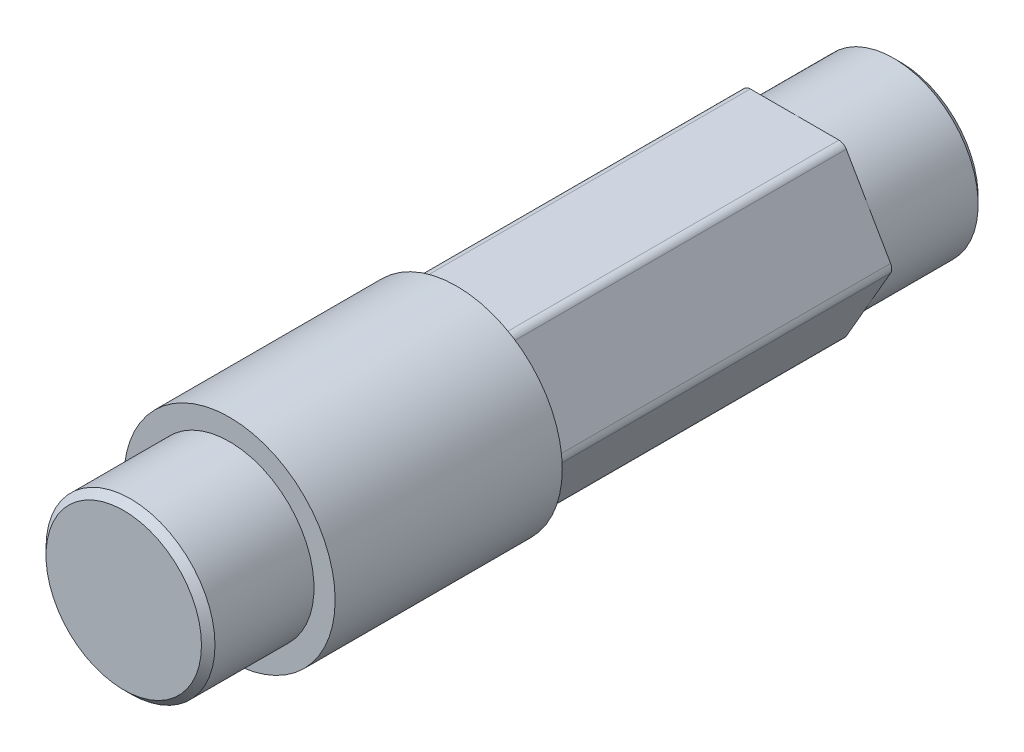
ISO-10303-21;
HEADER;
FILE_DESCRIPTION(('STEP AP214'),'2;1');
FILE_NAME('part.step','',(''),(''),'','','');
FILE_SCHEMA(('AUTOMOTIVE_DESIGN { 1 0 10303 214 1 1 1 1 }'));
ENDSEC;
DATA;
#1=APPLICATION_CONTEXT('core data for automotive mechanical design processes');
#2=APPLICATION_PROTOCOL_DEFINITION('international standard','automotive_design',2000,#1);
#3=PRODUCT_CONTEXT('',#1,'mechanical');
#4=PRODUCT('Part','Part','',(#3));
#5=PRODUCT_RELATED_PRODUCT_CATEGORY('part','',(#4));
#6=PRODUCT_DEFINITION_FORMATION('','',#4);
#7=PRODUCT_DEFINITION_CONTEXT('part definition',#1,'design');
#8=PRODUCT_DEFINITION('design','',#6,#7);
#9=PRODUCT_DEFINITION_SHAPE('','',#8);
#10=(LENGTH_UNIT() NAMED_UNIT(*) SI_UNIT(.MILLI.,.METRE.));
#11=(NAMED_UNIT(*) PLANE_ANGLE_UNIT() SI_UNIT($,.RADIAN.));
#12=(NAMED_UNIT(*) SI_UNIT($,.STERADIAN.) SOLID_ANGLE_UNIT());
#13=UNCERTAINTY_MEASURE_WITH_UNIT(LENGTH_MEASURE(1.E-05),#10,'distance_accuracy_value','');
#14=(GEOMETRIC_REPRESENTATION_CONTEXT(3) GLOBAL_UNCERTAINTY_ASSIGNED_CONTEXT((#13)) GLOBAL_UNIT_ASSIGNED_CONTEXT((#10,
#11,#12)) REPRESENTATION_CONTEXT('',''));
#15=CARTESIAN_POINT('',(0.,0.,0.));
#16=DIRECTION('',(0.,0.,1.));
#17=DIRECTION('',(1.,0.,0.));
#18=AXIS2_PLACEMENT_3D('',#15,#16,#17);
#19=CARTESIAN_POINT('',(0.,0.,25.019));
#20=DIRECTION('',(0.,0.,1.));
#21=DIRECTION('',(1.,0.,0.));
#22=AXIS2_PLACEMENT_3D('',#19,#20,#21);
#23=PLANE('',#22);
#24=CARTESIAN_POINT('',(0.,0.,25.019));
#25=DIRECTION('',(0.,0.,1.));
#26=DIRECTION('',(1.,0.,0.));
#27=AXIS2_PLACEMENT_3D('',#24,#25,#26);
#28=CIRCLE('',#27,5.842);
#29=CARTESIAN_POINT('',(5.842,0.,25.019));
#30=VERTEX_POINT('',#29);
#31=EDGE_CURVE('E144',#30,#30,#28,.T.);
#32=ORIENTED_EDGE('',*,*,#31,.T.);
#33=EDGE_LOOP('',(#32));
#34=FACE_BOUND('',#33,.T.);
#35=ADVANCED_FACE('F35',(#34),#23,.T.);
#36=CARTESIAN_POINT('',(0.,0.,0.));
#37=DIRECTION('',(0.,0.,-1.));
#38=DIRECTION('',(-1.,0.,0.));
#39=AXIS2_PLACEMENT_3D('',#36,#37,#38);
#40=CYLINDRICAL_SURFACE('',#39,6.35);
#41=CARTESIAN_POINT('',(0.,0.,24.511));
#42=DIRECTION('',(0.,0.,1.));
#43=DIRECTION('',(1.,0.,0.));
#44=AXIS2_PLACEMENT_3D('',#41,#42,#43);
#45=CIRCLE('',#44,6.35);
#46=CARTESIAN_POINT('',(6.35,0.,24.511));
#47=VERTEX_POINT('',#46);
#48=EDGE_CURVE('E148',#47,#47,#45,.F.);
#49=ORIENTED_EDGE('',*,*,#48,.T.);
#50=EDGE_LOOP('',(#49));
#51=FACE_BOUND('',#50,.T.);
#52=CARTESIAN_POINT('',(0.,0.,17.0688));
#53=DIRECTION('',(0.,0.,-1.));
#54=DIRECTION('',(-1.,0.,0.));
#55=AXIS2_PLACEMENT_3D('',#52,#53,#54);
#56=CIRCLE('',#55,6.35);
#57=CARTESIAN_POINT('',(-6.35,0.,17.0688));
#58=VERTEX_POINT('',#57);
#59=EDGE_CURVE('E239',#58,#58,#56,.T.);
#60=ORIENTED_EDGE('',*,*,#59,.F.);
#61=EDGE_LOOP('',(#60));
#62=FACE_BOUND('',#61,.T.);
#63=ADVANCED_FACE('F250',(#51,#62),#40,.T.);
#64=CARTESIAN_POINT('',(0.,6.35,17.0688));
#65=DIRECTION('',(0.,0.,1.));
#66=DIRECTION('',(1.,0.,0.));
#67=AXIS2_PLACEMENT_3D('',#64,#65,#66);
#68=PLANE('',#67);
#69=ORIENTED_EDGE('',*,*,#59,.T.);
#70=EDGE_LOOP('',(#69));
#71=FACE_BOUND('',#70,.T.);
#72=CARTESIAN_POINT('',(0.,0.,17.0688));
#73=DIRECTION('',(0.,0.,-1.));
#74=DIRECTION('',(-1.,0.,0.));
#75=AXIS2_PLACEMENT_3D('',#72,#73,#74);
#76=CIRCLE('',#75,7.9375);
#77=CARTESIAN_POINT('',(-7.9375,0.,17.0688));
#78=VERTEX_POINT('',#77);
#79=EDGE_CURVE('E236',#78,#78,#76,.T.);
#80=ORIENTED_EDGE('',*,*,#79,.F.);
#81=EDGE_LOOP('',(#80));
#82=FACE_BOUND('',#81,.T.);
#83=ADVANCED_FACE('F276',(#71,#82),#68,.T.);
#84=CARTESIAN_POINT('',(0.,0.,0.));
#85=DIRECTION('',(0.,0.,-1.));
#86=DIRECTION('',(-1.,0.,0.));
#87=AXIS2_PLACEMENT_3D('',#84,#85,#86);
#88=CYLINDRICAL_SURFACE('',#87,7.9375);
#89=ORIENTED_EDGE('',*,*,#79,.T.);
#90=EDGE_LOOP('',(#89));
#91=FACE_BOUND('',#90,.T.);
#92=CARTESIAN_POINT('',(0.,0.,0.));
#93=DIRECTION('',(0.,0.,-1.));
#94=DIRECTION('',(-1.,0.,0.));
#95=AXIS2_PLACEMENT_3D('',#92,#93,#94);
#96=CIRCLE('',#95,7.9375);
#97=CARTESIAN_POINT('',(-7.9375,0.,0.));
#98=VERTEX_POINT('',#97);
#99=EDGE_CURVE('E232',#98,#98,#96,.T.);
#100=ORIENTED_EDGE('',*,*,#99,.F.);
#101=EDGE_LOOP('',(#100));
#102=FACE_BOUND('',#101,.T.);
#103=ADVANCED_FACE('F281',(#91,#102),#88,.T.);
#104=CARTESIAN_POINT('',(0.,7.9375,0.));
#105=DIRECTION('',(0.,0.,-1.));
#106=DIRECTION('',(-1.,0.,0.));
#107=AXIS2_PLACEMENT_3D('',#104,#105,#106);
#108=PLANE('',#107);
#109=ORIENTED_EDGE('',*,*,#99,.T.);
#110=EDGE_LOOP('',(#109));
#111=FACE_BOUND('',#110,.T.);
#112=DIRECTION('',(-0.499999999999999,0.866025403784439,0.));
#113=VECTOR('',#112,1.);
#114=CARTESIAN_POINT('',(3.6969700727127,6.40334,0.));
#115=LINE('',#114,#113);
#116=CARTESIAN_POINT('',(7.21063143495769,0.317499999999993,0.));
#117=VERTEX_POINT('',#116);
#118=CARTESIAN_POINT('',(3.88027878318041,6.08584,0.));
#119=VERTEX_POINT('',#118);
#120=EDGE_CURVE('E233',#117,#119,#115,.T.);
#121=ORIENTED_EDGE('',*,*,#120,.T.);
#122=CARTESIAN_POINT('',(3.33035265177729,5.76834,0.));
#123=DIRECTION('',(0.,0.,-1.));
#124=DIRECTION('',(-1.,0.,0.));
#125=AXIS2_PLACEMENT_3D('',#122,#123,#124);
#126=CIRCLE('',#125,0.635);
#127=CARTESIAN_POINT('',(3.33035265177729,6.40334,0.));
#128=VERTEX_POINT('',#127);
#129=EDGE_CURVE('E184',#119,#128,#126,.F.);
#130=ORIENTED_EDGE('',*,*,#129,.T.);
#131=DIRECTION('',(-1.,0.,0.));
#132=VECTOR('',#131,1.);
#133=CARTESIAN_POINT('',(-3.6969700727127,6.40334,0.));
#134=LINE('',#133,#132);
#135=CARTESIAN_POINT('',(-3.33035265177728,6.40334,0.));
#136=VERTEX_POINT('',#135);
#137=EDGE_CURVE('E227',#128,#136,#134,.T.);
#138=ORIENTED_EDGE('',*,*,#137,.T.);
#139=CARTESIAN_POINT('',(-3.33035265177728,5.76834,0.));
#140=DIRECTION('',(0.,0.,-1.));
#141=DIRECTION('',(-1.,0.,0.));
#142=AXIS2_PLACEMENT_3D('',#139,#140,#141);
#143=CIRCLE('',#142,0.635);
#144=CARTESIAN_POINT('',(-3.8802787831804,6.08584,0.));
#145=VERTEX_POINT('',#144);
#146=EDGE_CURVE('E12',#136,#145,#143,.F.);
#147=ORIENTED_EDGE('',*,*,#146,.T.);
#148=DIRECTION('',(-0.5,-0.866025403784439,0.));
#149=VECTOR('',#148,1.);
#150=CARTESIAN_POINT('',(-7.3939401454254,0.,0.));
#151=LINE('',#150,#149);
#152=CARTESIAN_POINT('',(-7.21063143495769,0.317500000000003,0.));
#153=VERTEX_POINT('',#152);
#154=EDGE_CURVE('E198',#145,#153,#151,.T.);
#155=ORIENTED_EDGE('',*,*,#154,.T.);
#156=CARTESIAN_POINT('',(-6.66070530355457,0.,0.));
#157=DIRECTION('',(0.,0.,-1.));
#158=DIRECTION('',(-1.,0.,0.));
#159=AXIS2_PLACEMENT_3D('',#156,#157,#158);
#160=CIRCLE('',#159,0.635);
#161=CARTESIAN_POINT('',(-7.21063143495769,-0.317499999999997,0.));
#162=VERTEX_POINT('',#161);
#163=EDGE_CURVE('E43',#153,#162,#160,.F.);
#164=ORIENTED_EDGE('',*,*,#163,.T.);
#165=DIRECTION('',(0.5,-0.866025403784439,0.));
#166=VECTOR('',#165,1.);
#167=CARTESIAN_POINT('',(-3.6969700727127,-6.40334,0.));
#168=LINE('',#167,#166);
#169=CARTESIAN_POINT('',(-3.88027878318041,-6.08584,0.));
#170=VERTEX_POINT('',#169);
#171=EDGE_CURVE('E196',#162,#170,#168,.T.);
#172=ORIENTED_EDGE('',*,*,#171,.T.);
#173=CARTESIAN_POINT('',(-3.33035265177729,-5.76834,0.));
#174=DIRECTION('',(0.,0.,-1.));
#175=DIRECTION('',(-1.,0.,0.));
#176=AXIS2_PLACEMENT_3D('',#173,#174,#175);
#177=CIRCLE('',#176,0.635);
#178=CARTESIAN_POINT('',(-3.33035265177729,-6.40334,0.));
#179=VERTEX_POINT('',#178);
#180=EDGE_CURVE('E190',#170,#179,#177,.F.);
#181=ORIENTED_EDGE('',*,*,#180,.T.);
#182=DIRECTION('',(1.,0.,0.));
#183=VECTOR('',#182,1.);
#184=CARTESIAN_POINT('',(3.6969700727127,-6.40334,0.));
#185=LINE('',#184,#183);
#186=CARTESIAN_POINT('',(3.33035265177728,-6.40334,0.));
#187=VERTEX_POINT('',#186);
#188=EDGE_CURVE('E206',#179,#187,#185,.T.);
#189=ORIENTED_EDGE('',*,*,#188,.T.);
#190=CARTESIAN_POINT('',(3.33035265177728,-5.76834,0.));
#191=DIRECTION('',(0.,0.,-1.));
#192=DIRECTION('',(-1.,0.,0.));
#193=AXIS2_PLACEMENT_3D('',#190,#191,#192);
#194=CIRCLE('',#193,0.635);
#195=CARTESIAN_POINT('',(3.8802787831804,-6.08584,0.));
#196=VERTEX_POINT('',#195);
#197=EDGE_CURVE('E188',#187,#196,#194,.F.);
#198=ORIENTED_EDGE('',*,*,#197,.T.);
#199=DIRECTION('',(0.5,0.866025403784438,0.));
#200=VECTOR('',#199,1.);
#201=CARTESIAN_POINT('',(7.39394014542539,0.,0.));
#202=LINE('',#201,#200);
#203=CARTESIAN_POINT('',(7.21063143495769,-0.317500000000005,0.));
#204=VERTEX_POINT('',#203);
#205=EDGE_CURVE('E333',#196,#204,#202,.T.);
#206=ORIENTED_EDGE('',*,*,#205,.T.);
#207=CARTESIAN_POINT('',(6.66070530355457,0.,0.));
#208=DIRECTION('',(0.,0.,-1.));
#209=DIRECTION('',(-1.,0.,0.));
#210=AXIS2_PLACEMENT_3D('',#207,#208,#209);
#211=CIRCLE('',#210,0.635);
#212=EDGE_CURVE('E186',#204,#117,#211,.F.);
#213=ORIENTED_EDGE('',*,*,#212,.T.);
#214=EDGE_LOOP('',(#121,#130,#138,#147,#155,#164,#172,#181,#189,#198,#206,#213));
#215=FACE_BOUND('',#214,.T.);
#216=ADVANCED_FACE('F195',(#111,#215),#108,.T.);
#217=CARTESIAN_POINT('',(-3.6969700727127,6.40334,22.6751467056996));
#218=DIRECTION('',(0.,1.,0.));
#219=DIRECTION('',(-1.,0.,0.));
#220=AXIS2_PLACEMENT_3D('',#217,#218,#219);
#221=PLANE('',#220);
#222=ORIENTED_EDGE('',*,*,#137,.F.);
#223=DIRECTION('',(0.,0.,-1.));
#224=VECTOR('',#223,1.);
#225=CARTESIAN_POINT('',(3.33035265177729,6.40334,22.6751467056996));
#226=LINE('',#225,#224);
#227=CARTESIAN_POINT('',(3.33035265177729,6.40334,-25.4));
#228=VERTEX_POINT('',#227);
#229=EDGE_CURVE('E134',#128,#228,#226,.T.);
#230=ORIENTED_EDGE('',*,*,#229,.T.);
#231=DIRECTION('',(1.,0.,0.));
#232=VECTOR('',#231,1.);
#233=CARTESIAN_POINT('',(-3.6969700727127,6.40334,-25.4));
#234=LINE('',#233,#232);
#235=CARTESIAN_POINT('',(-3.33035265177728,6.40334,-25.4));
#236=VERTEX_POINT('',#235);
#237=EDGE_CURVE('E127',#236,#228,#234,.T.);
#238=ORIENTED_EDGE('',*,*,#237,.F.);
#239=DIRECTION('',(0.,0.,-1.));
#240=VECTOR('',#239,1.);
#241=CARTESIAN_POINT('',(-3.33035265177728,6.40334,22.6751467056996));
#242=LINE('',#241,#240);
#243=EDGE_CURVE('E140',#236,#136,#242,.F.);
#244=ORIENTED_EDGE('',*,*,#243,.T.);
#245=EDGE_LOOP('',(#222,#230,#238,#244));
#246=FACE_BOUND('',#245,.T.);
#247=ADVANCED_FACE('F139',(#246),#221,.T.);
#248=CARTESIAN_POINT('',(3.6969700727127,6.40334,22.6751467056996));
#249=DIRECTION('',(0.866025403784439,0.499999999999999,0.));
#250=DIRECTION('',(-0.499999999999999,0.866025403784439,0.));
#251=AXIS2_PLACEMENT_3D('',#248,#249,#250);
#252=PLANE('',#251);
#253=DIRECTION('',(0.499999999999999,-0.866025403784439,0.));
#254=VECTOR('',#253,1.);
#255=CARTESIAN_POINT('',(3.6969700727127,6.40334,-25.4));
#256=LINE('',#255,#254);
#257=CARTESIAN_POINT('',(3.88027878318041,6.08584,-25.4));
#258=VERTEX_POINT('',#257);
#259=CARTESIAN_POINT('',(7.21063143495769,0.317499999999993,-25.4));
#260=VERTEX_POINT('',#259);
#261=EDGE_CURVE('E142',#258,#260,#256,.T.);
#262=ORIENTED_EDGE('',*,*,#261,.F.);
#263=DIRECTION('',(0.,0.,-1.));
#264=VECTOR('',#263,1.);
#265=CARTESIAN_POINT('',(3.88027878318041,6.08584,22.6751467056996));
#266=LINE('',#265,#264);
#267=EDGE_CURVE('E164',#258,#119,#266,.F.);
#268=ORIENTED_EDGE('',*,*,#267,.T.);
#269=ORIENTED_EDGE('',*,*,#120,.F.);
#270=DIRECTION('',(0.,0.,-1.));
#271=VECTOR('',#270,1.);
#272=CARTESIAN_POINT('',(7.21063143495769,0.317499999999994,22.6751467056996));
#273=LINE('',#272,#271);
#274=EDGE_CURVE('E161',#117,#260,#273,.T.);
#275=ORIENTED_EDGE('',*,*,#274,.T.);
#276=EDGE_LOOP('',(#262,#268,#269,#275));
#277=FACE_BOUND('',#276,.T.);
#278=ADVANCED_FACE('F304',(#277),#252,.T.);
#279=CARTESIAN_POINT('',(7.39394014542539,0.,22.6751467056996));
#280=DIRECTION('',(0.866025403784438,-0.5,0.));
#281=DIRECTION('',(0.5,0.866025403784438,0.));
#282=AXIS2_PLACEMENT_3D('',#279,#280,#281);
#283=PLANE('',#282);
#284=DIRECTION('',(-0.5,-0.866025403784438,0.));
#285=VECTOR('',#284,1.);
#286=CARTESIAN_POINT('',(7.39394014542539,0.,-25.4));
#287=LINE('',#286,#285);
#288=CARTESIAN_POINT('',(7.21063143495769,-0.317500000000005,-25.4));
#289=VERTEX_POINT('',#288);
#290=CARTESIAN_POINT('',(3.8802787831804,-6.08584,-25.4));
#291=VERTEX_POINT('',#290);
#292=EDGE_CURVE('E220',#289,#291,#287,.T.);
#293=ORIENTED_EDGE('',*,*,#292,.F.);
#294=DIRECTION('',(0.,0.,-1.));
#295=VECTOR('',#294,1.);
#296=CARTESIAN_POINT('',(7.21063143495769,-0.317500000000006,22.6751467056996));
#297=LINE('',#296,#295);
#298=EDGE_CURVE('E169',#289,#204,#297,.F.);
#299=ORIENTED_EDGE('',*,*,#298,.T.);
#300=ORIENTED_EDGE('',*,*,#205,.F.);
#301=DIRECTION('',(0.,0.,-1.));
#302=VECTOR('',#301,1.);
#303=CARTESIAN_POINT('',(3.8802787831804,-6.08584,22.6751467056996));
#304=LINE('',#303,#302);
#305=EDGE_CURVE('E166',#196,#291,#304,.T.);
#306=ORIENTED_EDGE('',*,*,#305,.T.);
#307=EDGE_LOOP('',(#293,#299,#300,#306));
#308=FACE_BOUND('',#307,.T.);
#309=ADVANCED_FACE('F307',(#308),#283,.T.);
#310=CARTESIAN_POINT('',(3.6969700727127,-6.40334,22.6751467056996));
#311=DIRECTION('',(0.,-1.,0.));
#312=DIRECTION('',(1.,0.,0.));
#313=AXIS2_PLACEMENT_3D('',#310,#311,#312);
#314=PLANE('',#313);
#315=DIRECTION('',(-1.,0.,0.));
#316=VECTOR('',#315,1.);
#317=CARTESIAN_POINT('',(3.6969700727127,-6.40334,-25.4));
#318=LINE('',#317,#316);
#319=CARTESIAN_POINT('',(3.33035265177728,-6.40334,-25.4));
#320=VERTEX_POINT('',#319);
#321=CARTESIAN_POINT('',(-3.33035265177729,-6.40334,-25.4));
#322=VERTEX_POINT('',#321);
#323=EDGE_CURVE('E223',#320,#322,#318,.T.);
#324=ORIENTED_EDGE('',*,*,#323,.F.);
#325=DIRECTION('',(0.,0.,-1.));
#326=VECTOR('',#325,1.);
#327=CARTESIAN_POINT('',(3.33035265177728,-6.40334,22.6751467056996));
#328=LINE('',#327,#326);
#329=EDGE_CURVE('E174',#320,#187,#328,.F.);
#330=ORIENTED_EDGE('',*,*,#329,.T.);
#331=ORIENTED_EDGE('',*,*,#188,.F.);
#332=DIRECTION('',(0.,0.,-1.));
#333=VECTOR('',#332,1.);
#334=CARTESIAN_POINT('',(-3.33035265177729,-6.40334,22.6751467056996));
#335=LINE('',#334,#333);
#336=EDGE_CURVE('E171',#179,#322,#335,.T.);
#337=ORIENTED_EDGE('',*,*,#336,.T.);
#338=EDGE_LOOP('',(#324,#330,#331,#337));
#339=FACE_BOUND('',#338,.T.);
#340=ADVANCED_FACE('F311',(#339),#314,.T.);
#341=CARTESIAN_POINT('',(-3.6969700727127,-6.40334,22.6751467056996));
#342=DIRECTION('',(-0.866025403784439,-0.5,0.));
#343=DIRECTION('',(0.5,-0.866025403784439,0.));
#344=AXIS2_PLACEMENT_3D('',#341,#342,#343);
#345=PLANE('',#344);
#346=DIRECTION('',(-0.5,0.866025403784439,0.));
#347=VECTOR('',#346,1.);
#348=CARTESIAN_POINT('',(-3.6969700727127,-6.40334,-25.4));
#349=LINE('',#348,#347);
#350=CARTESIAN_POINT('',(-3.88027878318041,-6.08584,-25.4));
#351=VERTEX_POINT('',#350);
#352=CARTESIAN_POINT('',(-7.21063143495769,-0.317499999999997,-25.4));
#353=VERTEX_POINT('',#352);
#354=EDGE_CURVE('E209',#351,#353,#349,.T.);
#355=ORIENTED_EDGE('',*,*,#354,.F.);
#356=DIRECTION('',(0.,0.,-1.));
#357=VECTOR('',#356,1.);
#358=CARTESIAN_POINT('',(-3.88027878318041,-6.08584,22.6751467056996));
#359=LINE('',#358,#357);
#360=EDGE_CURVE('E179',#351,#170,#359,.F.);
#361=ORIENTED_EDGE('',*,*,#360,.T.);
#362=ORIENTED_EDGE('',*,*,#171,.F.);
#363=DIRECTION('',(0.,0.,-1.));
#364=VECTOR('',#363,1.);
#365=CARTESIAN_POINT('',(-7.21063143495769,-0.317499999999997,22.6751467056996));
#366=LINE('',#365,#364);
#367=EDGE_CURVE('E176',#162,#353,#366,.T.);
#368=ORIENTED_EDGE('',*,*,#367,.T.);
#369=EDGE_LOOP('',(#355,#361,#362,#368));
#370=FACE_BOUND('',#369,.T.);
#371=ADVANCED_FACE('F203',(#370),#345,.T.);
#372=CARTESIAN_POINT('',(-7.3939401454254,0.,22.6751467056996));
#373=DIRECTION('',(-0.866025403784438,0.5,0.));
#374=DIRECTION('',(-0.5,-0.866025403784439,0.));
#375=AXIS2_PLACEMENT_3D('',#372,#373,#374);
#376=PLANE('',#375);
#377=DIRECTION('',(0.5,0.866025403784439,0.));
#378=VECTOR('',#377,1.);
#379=CARTESIAN_POINT('',(-7.3939401454254,0.,-25.4));
#380=LINE('',#379,#378);
#381=CARTESIAN_POINT('',(-7.21063143495769,0.317500000000003,-25.4));
#382=VERTEX_POINT('',#381);
#383=CARTESIAN_POINT('',(-3.8802787831804,6.08584,-25.4));
#384=VERTEX_POINT('',#383);
#385=EDGE_CURVE('E128',#382,#384,#380,.T.);
#386=ORIENTED_EDGE('',*,*,#385,.F.);
#387=DIRECTION('',(0.,0.,-1.));
#388=VECTOR('',#387,1.);
#389=CARTESIAN_POINT('',(-7.21063143495769,0.317500000000003,22.6751467056996));
#390=LINE('',#389,#388);
#391=EDGE_CURVE('E50',#382,#153,#390,.F.);
#392=ORIENTED_EDGE('',*,*,#391,.T.);
#393=ORIENTED_EDGE('',*,*,#154,.F.);
#394=DIRECTION('',(0.,0.,-1.));
#395=VECTOR('',#394,1.);
#396=CARTESIAN_POINT('',(-3.8802787831804,6.08584,22.6751467056996));
#397=LINE('',#396,#395);
#398=EDGE_CURVE('E181',#145,#384,#397,.T.);
#399=ORIENTED_EDGE('',*,*,#398,.T.);
#400=EDGE_LOOP('',(#386,#392,#393,#399));
#401=FACE_BOUND('',#400,.T.);
#402=ADVANCED_FACE('F210',(#401),#376,.T.);
#403=CARTESIAN_POINT('',(0.,6.35,-33.3502));
#404=DIRECTION('',(0.,0.,-1.));
#405=DIRECTION('',(-1.,0.,0.));
#406=AXIS2_PLACEMENT_3D('',#403,#404,#405);
#407=PLANE('',#406);
#408=CARTESIAN_POINT('',(0.,0.,-33.3502));
#409=DIRECTION('',(0.,0.,-1.));
#410=DIRECTION('',(-1.,0.,0.));
#411=AXIS2_PLACEMENT_3D('',#408,#409,#410);
#412=CIRCLE('',#411,3.175);
#413=CARTESIAN_POINT('',(-3.175,0.,-33.3502));
#414=VERTEX_POINT('',#413);
#415=EDGE_CURVE('E214',#414,#414,#412,.T.);
#416=ORIENTED_EDGE('',*,*,#415,.F.);
#417=EDGE_LOOP('',(#416));
#418=FACE_BOUND('',#417,.T.);
#419=CARTESIAN_POINT('',(0.,0.,-33.3502));
#420=DIRECTION('',(0.,0.,-1.));
#421=DIRECTION('',(-1.,0.,0.));
#422=AXIS2_PLACEMENT_3D('',#419,#420,#421);
#423=CIRCLE('',#422,5.842);
#424=CARTESIAN_POINT('',(-5.842,0.,-33.3502));
#425=VERTEX_POINT('',#424);
#426=EDGE_CURVE('E242',#425,#425,#423,.T.);
#427=ORIENTED_EDGE('',*,*,#426,.T.);
#428=EDGE_LOOP('',(#427));
#429=FACE_BOUND('',#428,.T.);
#430=ADVANCED_FACE('F295',(#418,#429),#407,.T.);
#431=CARTESIAN_POINT('',(0.,0.,0.));
#432=DIRECTION('',(0.,0.,-1.));
#433=DIRECTION('',(-1.,0.,0.));
#434=AXIS2_PLACEMENT_3D('',#431,#432,#433);
#435=CYLINDRICAL_SURFACE('',#434,6.35);
#436=CARTESIAN_POINT('',(0.,0.,-32.8422));
#437=DIRECTION('',(0.,0.,-1.));
#438=DIRECTION('',(-1.,0.,0.));
#439=AXIS2_PLACEMENT_3D('',#436,#437,#438);
#440=CIRCLE('',#439,6.35);
#441=CARTESIAN_POINT('',(-6.35,0.,-32.8422));
#442=VERTEX_POINT('',#441);
#443=EDGE_CURVE('E245',#442,#442,#440,.F.);
#444=ORIENTED_EDGE('',*,*,#443,.T.);
#445=EDGE_LOOP('',(#444));
#446=FACE_BOUND('',#445,.T.);
#447=CARTESIAN_POINT('',(0.,0.,-25.4));
#448=DIRECTION('',(0.,0.,-1.));
#449=DIRECTION('',(-1.,0.,0.));
#450=AXIS2_PLACEMENT_3D('',#447,#448,#449);
#451=CIRCLE('',#450,6.35);
#452=CARTESIAN_POINT('',(-6.35,0.,-25.4));
#453=VERTEX_POINT('',#452);
#454=EDGE_CURVE('E229',#453,#453,#451,.T.);
#455=ORIENTED_EDGE('',*,*,#454,.T.);
#456=EDGE_LOOP('',(#455));
#457=FACE_BOUND('',#456,.T.);
#458=ADVANCED_FACE('F291',(#446,#457),#435,.T.);
#459=CARTESIAN_POINT('',(0.,7.62,-25.4));
#460=DIRECTION('',(0.,0.,-1.));
#461=DIRECTION('',(-1.,0.,0.));
#462=AXIS2_PLACEMENT_3D('',#459,#460,#461);
#463=PLANE('',#462);
#464=ORIENTED_EDGE('',*,*,#454,.F.);
#465=EDGE_LOOP('',(#464));
#466=FACE_BOUND('',#465,.T.);
#467=ORIENTED_EDGE('',*,*,#237,.T.);
#468=CARTESIAN_POINT('',(3.33035265177729,5.76834,-25.4));
#469=DIRECTION('',(0.,0.,-1.));
#470=DIRECTION('',(-1.,0.,0.));
#471=AXIS2_PLACEMENT_3D('',#468,#469,#470);
#472=CIRCLE('',#471,0.635);
#473=EDGE_CURVE('E159',#228,#258,#472,.T.);
#474=ORIENTED_EDGE('',*,*,#473,.T.);
#475=ORIENTED_EDGE('',*,*,#261,.T.);
#476=CARTESIAN_POINT('',(6.66070530355457,0.,-25.4));
#477=DIRECTION('',(0.,0.,-1.));
#478=DIRECTION('',(-1.,0.,0.));
#479=AXIS2_PLACEMENT_3D('',#476,#477,#478);
#480=CIRCLE('',#479,0.635);
#481=EDGE_CURVE('E157',#260,#289,#480,.T.);
#482=ORIENTED_EDGE('',*,*,#481,.T.);
#483=ORIENTED_EDGE('',*,*,#292,.T.);
#484=CARTESIAN_POINT('',(3.33035265177728,-5.76834,-25.4));
#485=DIRECTION('',(0.,0.,-1.));
#486=DIRECTION('',(-1.,0.,0.));
#487=AXIS2_PLACEMENT_3D('',#484,#485,#486);
#488=CIRCLE('',#487,0.635);
#489=EDGE_CURVE('E155',#291,#320,#488,.T.);
#490=ORIENTED_EDGE('',*,*,#489,.T.);
#491=ORIENTED_EDGE('',*,*,#323,.T.);
#492=CARTESIAN_POINT('',(-3.33035265177729,-5.76834,-25.4));
#493=DIRECTION('',(0.,0.,-1.));
#494=DIRECTION('',(-1.,0.,0.));
#495=AXIS2_PLACEMENT_3D('',#492,#493,#494);
#496=CIRCLE('',#495,0.635);
#497=EDGE_CURVE('E153',#322,#351,#496,.T.);
#498=ORIENTED_EDGE('',*,*,#497,.T.);
#499=ORIENTED_EDGE('',*,*,#354,.T.);
#500=CARTESIAN_POINT('',(-6.66070530355457,0.,-25.4));
#501=DIRECTION('',(0.,0.,-1.));
#502=DIRECTION('',(-1.,0.,0.));
#503=AXIS2_PLACEMENT_3D('',#500,#501,#502);
#504=CIRCLE('',#503,0.635);
#505=EDGE_CURVE('E133',#353,#382,#504,.T.);
#506=ORIENTED_EDGE('',*,*,#505,.T.);
#507=ORIENTED_EDGE('',*,*,#385,.T.);
#508=CARTESIAN_POINT('',(-3.33035265177728,5.76834,-25.4));
#509=DIRECTION('',(0.,0.,-1.));
#510=DIRECTION('',(-1.,0.,0.));
#511=AXIS2_PLACEMENT_3D('',#508,#509,#510);
#512=CIRCLE('',#511,0.635);
#513=EDGE_CURVE('E124',#384,#236,#512,.T.);
#514=ORIENTED_EDGE('',*,*,#513,.T.);
#515=EDGE_LOOP('',(#467,#474,#475,#482,#483,#490,#491,#498,#499,#506,#507,#514));
#516=FACE_BOUND('',#515,.T.);
#517=ADVANCED_FACE('F126',(#466,#516),#463,.T.);
#518=CARTESIAN_POINT('',(0.,0.,-33.3502));
#519=DIRECTION('',(0.,0.,1.));
#520=DIRECTION('',(1.,0.,0.));
#521=AXIS2_PLACEMENT_3D('',#518,#519,#520);
#522=CONICAL_SURFACE('',#521,5.842,0.78539816339745);
#523=ORIENTED_EDGE('',*,*,#443,.F.);
#524=EDGE_LOOP('',(#523));
#525=FACE_BOUND('',#524,.T.);
#526=ORIENTED_EDGE('',*,*,#426,.F.);
#527=EDGE_LOOP('',(#526));
#528=FACE_BOUND('',#527,.T.);
#529=ADVANCED_FACE('F256',(#525,#528),#522,.T.);
#530=CARTESIAN_POINT('',(0.,0.,24.511));
#531=DIRECTION('',(0.,0.,-1.));
#532=DIRECTION('',(-1.,0.,0.));
#533=AXIS2_PLACEMENT_3D('',#530,#531,#532);
#534=CONICAL_SURFACE('',#533,6.35,0.785398163397457);
#535=ORIENTED_EDGE('',*,*,#31,.F.);
#536=EDGE_LOOP('',(#535));
#537=FACE_BOUND('',#536,.T.);
#538=ORIENTED_EDGE('',*,*,#48,.F.);
#539=EDGE_LOOP('',(#538));
#540=FACE_BOUND('',#539,.T.);
#541=ADVANCED_FACE('F253',(#537,#540),#534,.T.);
#542=CARTESIAN_POINT('',(0.,0.,-26.4922));
#543=DIRECTION('',(0.,0.,-1.));
#544=DIRECTION('',(-1.,0.,0.));
#545=AXIS2_PLACEMENT_3D('',#542,#543,#544);
#546=CYLINDRICAL_SURFACE('',#545,3.175);
#547=CARTESIAN_POINT('',(0.,0.,-26.4922));
#548=DIRECTION('',(0.,0.,-1.));
#549=DIRECTION('',(-1.,0.,0.));
#550=AXIS2_PLACEMENT_3D('',#547,#548,#549);
#551=CIRCLE('',#550,3.175);
#552=CARTESIAN_POINT('',(-3.175,0.,-26.4922));
#553=VERTEX_POINT('',#552);
#554=EDGE_CURVE('E211',#553,#553,#551,.T.);
#555=ORIENTED_EDGE('',*,*,#554,.F.);
#556=EDGE_LOOP('',(#555));
#557=FACE_BOUND('',#556,.T.);
#558=ORIENTED_EDGE('',*,*,#415,.T.);
#559=EDGE_LOOP('',(#558));
#560=FACE_BOUND('',#559,.T.);
#561=ADVANCED_FACE('F255',(#557,#560),#546,.F.);
#562=CARTESIAN_POINT('',(0.,0.,-26.4922));
#563=DIRECTION('',(0.,0.,-1.));
#564=DIRECTION('',(-1.,0.,0.));
#565=AXIS2_PLACEMENT_3D('',#562,#563,#564);
#566=PLANE('',#565);
#567=ORIENTED_EDGE('',*,*,#554,.T.);
#568=EDGE_LOOP('',(#567));
#569=FACE_BOUND('',#568,.T.);
#570=ADVANCED_FACE('F263',(#569),#566,.T.);
#571=CARTESIAN_POINT('',(3.33035265177729,5.76834,22.6751467056996));
#572=DIRECTION('',(0.,0.,-1.));
#573=DIRECTION('',(-1.,0.,0.));
#574=AXIS2_PLACEMENT_3D('',#571,#572,#573);
#575=CYLINDRICAL_SURFACE('',#574,0.635);
#576=ORIENTED_EDGE('',*,*,#129,.F.);
#577=ORIENTED_EDGE('',*,*,#267,.F.);
#578=ORIENTED_EDGE('',*,*,#473,.F.);
#579=ORIENTED_EDGE('',*,*,#229,.F.);
#580=EDGE_LOOP('',(#576,#577,#578,#579));
#581=FACE_BOUND('',#580,.T.);
#582=ADVANCED_FACE('F319',(#581),#575,.T.);
#583=CARTESIAN_POINT('',(6.66070530355457,0.,22.6751467056996));
#584=DIRECTION('',(0.,0.,-1.));
#585=DIRECTION('',(-1.,0.,0.));
#586=AXIS2_PLACEMENT_3D('',#583,#584,#585);
#587=CYLINDRICAL_SURFACE('',#586,0.635);
#588=ORIENTED_EDGE('',*,*,#212,.F.);
#589=ORIENTED_EDGE('',*,*,#298,.F.);
#590=ORIENTED_EDGE('',*,*,#481,.F.);
#591=ORIENTED_EDGE('',*,*,#274,.F.);
#592=EDGE_LOOP('',(#588,#589,#590,#591));
#593=FACE_BOUND('',#592,.T.);
#594=ADVANCED_FACE('F324',(#593),#587,.T.);
#595=CARTESIAN_POINT('',(3.33035265177728,-5.76834,22.6751467056996));
#596=DIRECTION('',(0.,0.,-1.));
#597=DIRECTION('',(-1.,0.,0.));
#598=AXIS2_PLACEMENT_3D('',#595,#596,#597);
#599=CYLINDRICAL_SURFACE('',#598,0.635);
#600=ORIENTED_EDGE('',*,*,#197,.F.);
#601=ORIENTED_EDGE('',*,*,#329,.F.);
#602=ORIENTED_EDGE('',*,*,#489,.F.);
#603=ORIENTED_EDGE('',*,*,#305,.F.);
#604=EDGE_LOOP('',(#600,#601,#602,#603));
#605=FACE_BOUND('',#604,.T.);
#606=ADVANCED_FACE('F344',(#605),#599,.T.);
#607=CARTESIAN_POINT('',(-3.33035265177729,-5.76834,22.6751467056996));
#608=DIRECTION('',(0.,0.,-1.));
#609=DIRECTION('',(-1.,0.,0.));
#610=AXIS2_PLACEMENT_3D('',#607,#608,#609);
#611=CYLINDRICAL_SURFACE('',#610,0.635);
#612=ORIENTED_EDGE('',*,*,#180,.F.);
#613=ORIENTED_EDGE('',*,*,#360,.F.);
#614=ORIENTED_EDGE('',*,*,#497,.F.);
#615=ORIENTED_EDGE('',*,*,#336,.F.);
#616=EDGE_LOOP('',(#612,#613,#614,#615));
#617=FACE_BOUND('',#616,.T.);
#618=ADVANCED_FACE('F360',(#617),#611,.T.);
#619=CARTESIAN_POINT('',(-6.66070530355457,0.,22.6751467056996));
#620=DIRECTION('',(0.,0.,-1.));
#621=DIRECTION('',(-1.,0.,0.));
#622=AXIS2_PLACEMENT_3D('',#619,#620,#621);
#623=CYLINDRICAL_SURFACE('',#622,0.635);
#624=ORIENTED_EDGE('',*,*,#163,.F.);
#625=ORIENTED_EDGE('',*,*,#391,.F.);
#626=ORIENTED_EDGE('',*,*,#505,.F.);
#627=ORIENTED_EDGE('',*,*,#367,.F.);
#628=EDGE_LOOP('',(#624,#625,#626,#627));
#629=FACE_BOUND('',#628,.T.);
#630=ADVANCED_FACE('F208',(#629),#623,.T.);
#631=CARTESIAN_POINT('',(-3.33035265177728,5.76834,22.6751467056996));
#632=DIRECTION('',(0.,0.,-1.));
#633=DIRECTION('',(-1.,0.,0.));
#634=AXIS2_PLACEMENT_3D('',#631,#632,#633);
#635=CYLINDRICAL_SURFACE('',#634,0.635);
#636=ORIENTED_EDGE('',*,*,#146,.F.);
#637=ORIENTED_EDGE('',*,*,#243,.F.);
#638=ORIENTED_EDGE('',*,*,#513,.F.);
#639=ORIENTED_EDGE('',*,*,#398,.F.);
#640=EDGE_LOOP('',(#636,#637,#638,#639));
#641=FACE_BOUND('',#640,.T.);
#642=ADVANCED_FACE('F37',(#641),#635,.T.);
#643=CLOSED_SHELL('',(#35,#63,#83,#103,#216,#247,#278,#309,#340,#371,#402,#430,#458,#517,#529,
#541,#561,#570,#582,#594,#606,#618,#630,#642));
#644=MANIFOLD_SOLID_BREP('B2',#643);
#645=ADVANCED_BREP_SHAPE_REPRESENTATION('',(#18,#644),#14);
#646=SHAPE_DEFINITION_REPRESENTATION(#9,#645);
ENDSEC;
END-ISO-10303-21;
